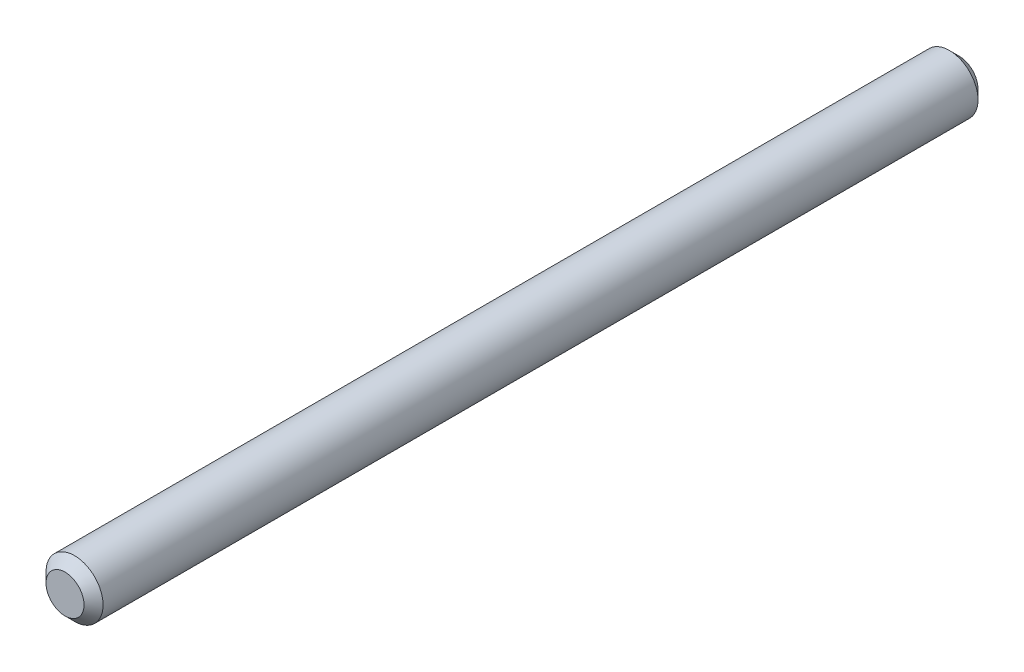
ISO-10303-21;
HEADER;
FILE_DESCRIPTION(('STEP AP214'),'2;1');
FILE_NAME('part.step','',(''),(''),'','','');
FILE_SCHEMA(('AUTOMOTIVE_DESIGN { 1 0 10303 214 1 1 1 1 }'));
ENDSEC;
DATA;
#1=APPLICATION_CONTEXT('core data for automotive mechanical design processes');
#2=APPLICATION_PROTOCOL_DEFINITION('international standard','automotive_design',2000,#1);
#3=PRODUCT_CONTEXT('',#1,'mechanical');
#4=PRODUCT('Part','Part','',(#3));
#5=PRODUCT_RELATED_PRODUCT_CATEGORY('part','',(#4));
#6=PRODUCT_DEFINITION_FORMATION('','',#4);
#7=PRODUCT_DEFINITION_CONTEXT('part definition',#1,'design');
#8=PRODUCT_DEFINITION('design','',#6,#7);
#9=PRODUCT_DEFINITION_SHAPE('','',#8);
#10=(LENGTH_UNIT() NAMED_UNIT(*) SI_UNIT(.MILLI.,.METRE.));
#11=(NAMED_UNIT(*) PLANE_ANGLE_UNIT() SI_UNIT($,.RADIAN.));
#12=(NAMED_UNIT(*) SI_UNIT($,.STERADIAN.) SOLID_ANGLE_UNIT());
#13=UNCERTAINTY_MEASURE_WITH_UNIT(LENGTH_MEASURE(1.E-05),#10,'distance_accuracy_value','');
#14=(GEOMETRIC_REPRESENTATION_CONTEXT(3) GLOBAL_UNCERTAINTY_ASSIGNED_CONTEXT((#13)) GLOBAL_UNIT_ASSIGNED_CONTEXT((#10,
#11,#12)) REPRESENTATION_CONTEXT('',''));
#15=CARTESIAN_POINT('',(0.,0.,0.));
#16=DIRECTION('',(0.,0.,1.));
#17=DIRECTION('',(1.,0.,0.));
#18=AXIS2_PLACEMENT_3D('',#15,#16,#17);
#19=CARTESIAN_POINT('',(0.,0.,-7.));
#20=DIRECTION('',(0.,0.,1.));
#21=DIRECTION('',(1.,0.,0.));
#22=AXIS2_PLACEMENT_3D('',#19,#20,#21);
#23=CYLINDRICAL_SURFACE('',#22,1.5);
#24=CARTESIAN_POINT('',(0.,0.,-6.49999999999999));
#25=DIRECTION('',(0.,0.,1.));
#26=DIRECTION('',(1.,0.,0.));
#27=AXIS2_PLACEMENT_3D('',#24,#25,#26);
#28=CIRCLE('',#27,1.5);
#29=CARTESIAN_POINT('',(1.5,0.,-6.49999999999999));
#30=VERTEX_POINT('',#29);
#31=EDGE_CURVE('E54',#30,#30,#28,.T.);
#32=ORIENTED_EDGE('',*,*,#31,.T.);
#33=EDGE_LOOP('',(#32));
#34=FACE_BOUND('',#33,.T.);
#35=CARTESIAN_POINT('',(0.,0.,39.5));
#36=DIRECTION('',(0.,0.,1.));
#37=DIRECTION('',(1.,0.,0.));
#38=AXIS2_PLACEMENT_3D('',#35,#36,#37);
#39=CIRCLE('',#38,1.5);
#40=CARTESIAN_POINT('',(1.5,0.,39.5));
#41=VERTEX_POINT('',#40);
#42=EDGE_CURVE('E60',#41,#41,#39,.F.);
#43=ORIENTED_EDGE('',*,*,#42,.T.);
#44=EDGE_LOOP('',(#43));
#45=FACE_BOUND('',#44,.T.);
#46=ADVANCED_FACE('F39',(#34,#45),#23,.T.);
#47=CARTESIAN_POINT('',(0.,0.,-7.));
#48=DIRECTION('',(0.,0.,1.));
#49=DIRECTION('',(1.,0.,0.));
#50=AXIS2_PLACEMENT_3D('',#47,#48,#49);
#51=PLANE('',#50);
#52=CARTESIAN_POINT('',(0.,0.,-7.));
#53=DIRECTION('',(0.,0.,1.));
#54=DIRECTION('',(1.,0.,0.));
#55=AXIS2_PLACEMENT_3D('',#52,#53,#54);
#56=CIRCLE('',#55,0.999999999999994);
#57=CARTESIAN_POINT('',(0.999999999999994,0.,-7.));
#58=VERTEX_POINT('',#57);
#59=EDGE_CURVE('E48',#58,#58,#56,.F.);
#60=ORIENTED_EDGE('',*,*,#59,.T.);
#61=EDGE_LOOP('',(#60));
#62=FACE_BOUND('',#61,.T.);
#63=ADVANCED_FACE('F101',(#62),#51,.F.);
#64=CARTESIAN_POINT('',(0.,0.,40.));
#65=DIRECTION('',(0.,0.,1.));
#66=DIRECTION('',(1.,0.,0.));
#67=AXIS2_PLACEMENT_3D('',#64,#65,#66);
#68=PLANE('',#67);
#69=CARTESIAN_POINT('',(0.,0.,40.));
#70=DIRECTION('',(0.,0.,1.));
#71=DIRECTION('',(1.,0.,0.));
#72=AXIS2_PLACEMENT_3D('',#69,#70,#71);
#73=CIRCLE('',#72,0.999999999999994);
#74=CARTESIAN_POINT('',(0.999999999999994,0.,40.));
#75=VERTEX_POINT('',#74);
#76=EDGE_CURVE('E10',#75,#75,#73,.T.);
#77=ORIENTED_EDGE('',*,*,#76,.T.);
#78=EDGE_LOOP('',(#77));
#79=FACE_BOUND('',#78,.T.);
#80=ADVANCED_FACE('F97',(#79),#68,.T.);
#81=CARTESIAN_POINT('',(0.,0.,-6.49999999999999));
#82=DIRECTION('',(0.,0.,1.));
#83=DIRECTION('',(1.,0.,0.));
#84=AXIS2_PLACEMENT_3D('',#81,#82,#83);
#85=CONICAL_SURFACE('',#84,1.5,0.785398163397447);
#86=ORIENTED_EDGE('',*,*,#59,.F.);
#87=EDGE_LOOP('',(#86));
#88=FACE_BOUND('',#87,.T.);
#89=ORIENTED_EDGE('',*,*,#31,.F.);
#90=EDGE_LOOP('',(#89));
#91=FACE_BOUND('',#90,.T.);
#92=ADVANCED_FACE('F100',(#88,#91),#85,.T.);
#93=CARTESIAN_POINT('',(0.,0.,40.));
#94=DIRECTION('',(0.,0.,-1.));
#95=DIRECTION('',(-1.,0.,0.));
#96=AXIS2_PLACEMENT_3D('',#93,#94,#95);
#97=CONICAL_SURFACE('',#96,0.999999999999994,0.785398163397447);
#98=ORIENTED_EDGE('',*,*,#42,.F.);
#99=EDGE_LOOP('',(#98));
#100=FACE_BOUND('',#99,.T.);
#101=ORIENTED_EDGE('',*,*,#76,.F.);
#102=EDGE_LOOP('',(#101));
#103=FACE_BOUND('',#102,.T.);
#104=ADVANCED_FACE('F42',(#100,#103),#97,.T.);
#105=CLOSED_SHELL('',(#46,#63,#80,#92,#104));
#106=CARTESIAN_POINT('',(0.,0.,15.5));
#107=DIRECTION('',(0.,0.,1.));
#108=DIRECTION('',(1.,0.,0.));
#109=AXIS2_PLACEMENT_3D('',#106,#107,#108);
#110=CYLINDRICAL_SURFACE('',#109,1.);
#111=CARTESIAN_POINT('',(0.,0.,15.5));
#112=DIRECTION('',(0.,0.,1.));
#113=DIRECTION('',(1.,0.,0.));
#114=AXIS2_PLACEMENT_3D('',#111,#112,#113);
#115=CIRCLE('',#114,1.);
#116=CARTESIAN_POINT('',(1.,0.,15.5));
#117=VERTEX_POINT('',#116);
#118=EDGE_CURVE('E66',#117,#117,#115,.T.);
#119=ORIENTED_EDGE('',*,*,#118,.F.);
#120=EDGE_LOOP('',(#119));
#121=FACE_BOUND('',#120,.T.);
#122=CARTESIAN_POINT('',(0.,0.,17.5));
#123=DIRECTION('',(0.,0.,1.));
#124=DIRECTION('',(1.,0.,0.));
#125=AXIS2_PLACEMENT_3D('',#122,#123,#124);
#126=CIRCLE('',#125,1.);
#127=CARTESIAN_POINT('',(1.,0.,17.5));
#128=VERTEX_POINT('',#127);
#129=EDGE_CURVE('E70',#128,#128,#126,.T.);
#130=ORIENTED_EDGE('',*,*,#129,.T.);
#131=EDGE_LOOP('',(#130));
#132=FACE_BOUND('',#131,.T.);
#133=ADVANCED_FACE('F76',(#121,#132),#110,.F.);
#134=CARTESIAN_POINT('',(0.,0.,15.5));
#135=DIRECTION('',(0.,0.,1.));
#136=DIRECTION('',(1.,0.,0.));
#137=AXIS2_PLACEMENT_3D('',#134,#135,#136);
#138=PLANE('',#137);
#139=ORIENTED_EDGE('',*,*,#118,.T.);
#140=EDGE_LOOP('',(#139));
#141=FACE_BOUND('',#140,.T.);
#142=ADVANCED_FACE('F80',(#141),#138,.T.);
#143=CARTESIAN_POINT('',(0.,0.,17.5));
#144=DIRECTION('',(0.,0.,1.));
#145=DIRECTION('',(1.,0.,0.));
#146=AXIS2_PLACEMENT_3D('',#143,#144,#145);
#147=PLANE('',#146);
#148=ORIENTED_EDGE('',*,*,#129,.F.);
#149=EDGE_LOOP('',(#148));
#150=FACE_BOUND('',#149,.T.);
#151=ADVANCED_FACE('F78',(#150),#147,.F.);
#152=CLOSED_SHELL('',(#133,#142,#151));
#153=ORIENTED_CLOSED_SHELL('',*,#152,.T.);
#154=BREP_WITH_VOIDS('B2',#105,(#153));
#155=ADVANCED_BREP_SHAPE_REPRESENTATION('',(#18,#154),#14);
#156=SHAPE_DEFINITION_REPRESENTATION(#9,#155);
ENDSEC;
END-ISO-10303-21;
